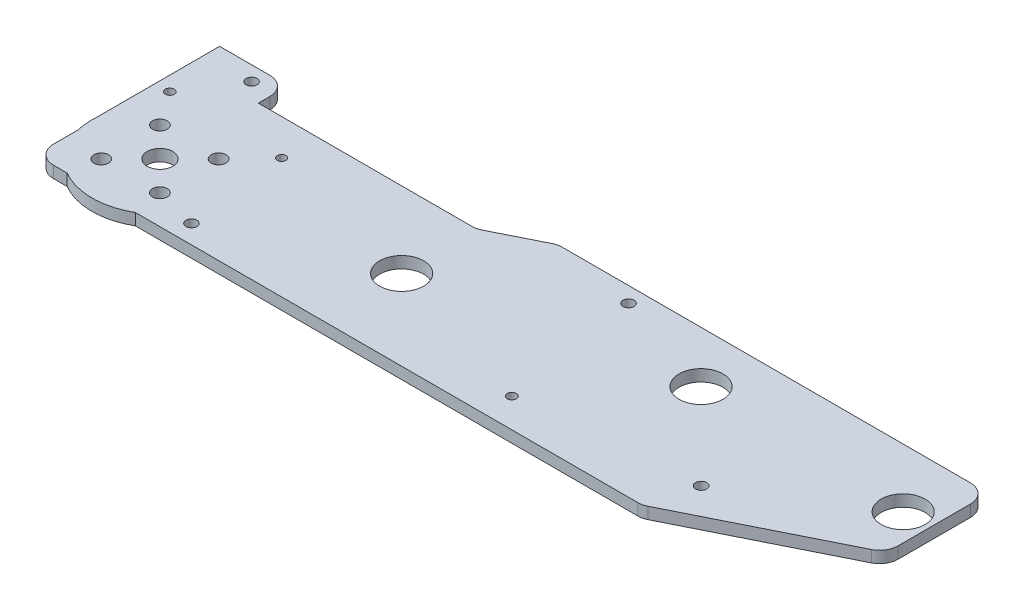
ISO-10303-21;
HEADER;
FILE_DESCRIPTION(('STEP AP214'),'2;1');
FILE_NAME('part.step','',(''),(''),'','','');
FILE_SCHEMA(('AUTOMOTIVE_DESIGN { 1 0 10303 214 1 1 1 1 }'));
ENDSEC;
DATA;
#1=APPLICATION_CONTEXT('core data for automotive mechanical design processes');
#2=APPLICATION_PROTOCOL_DEFINITION('international standard','automotive_design',2000,#1);
#3=PRODUCT_CONTEXT('',#1,'mechanical');
#4=PRODUCT('Part','Part','',(#3));
#5=PRODUCT_RELATED_PRODUCT_CATEGORY('part','',(#4));
#6=PRODUCT_DEFINITION_FORMATION('','',#4);
#7=PRODUCT_DEFINITION_CONTEXT('part definition',#1,'design');
#8=PRODUCT_DEFINITION('design','',#6,#7);
#9=PRODUCT_DEFINITION_SHAPE('','',#8);
#10=(LENGTH_UNIT() NAMED_UNIT(*) SI_UNIT(.MILLI.,.METRE.));
#11=(NAMED_UNIT(*) PLANE_ANGLE_UNIT() SI_UNIT($,.RADIAN.));
#12=(NAMED_UNIT(*) SI_UNIT($,.STERADIAN.) SOLID_ANGLE_UNIT());
#13=UNCERTAINTY_MEASURE_WITH_UNIT(LENGTH_MEASURE(1.E-05),#10,'distance_accuracy_value','');
#14=(GEOMETRIC_REPRESENTATION_CONTEXT(3) GLOBAL_UNCERTAINTY_ASSIGNED_CONTEXT((#13)) GLOBAL_UNIT_ASSIGNED_CONTEXT((#10,
#11,#12)) REPRESENTATION_CONTEXT('',''));
#15=CARTESIAN_POINT('',(0.,0.,0.));
#16=DIRECTION('',(0.,0.,1.));
#17=DIRECTION('',(1.,0.,0.));
#18=AXIS2_PLACEMENT_3D('',#15,#16,#17);
#19=CARTESIAN_POINT('',(18.,0.,34.));
#20=DIRECTION('',(0.,1.,0.));
#21=DIRECTION('',(0.,0.,1.));
#22=AXIS2_PLACEMENT_3D('',#19,#20,#21);
#23=CYLINDRICAL_SURFACE('',#22,18.5);
#24=CARTESIAN_POINT('',(18.,3.175,34.));
#25=DIRECTION('',(0.,1.,0.));
#26=DIRECTION('',(0.,0.,1.));
#27=AXIS2_PLACEMENT_3D('',#24,#25,#26);
#28=CIRCLE('',#27,18.5);
#29=CARTESIAN_POINT('',(-0.445022074948467,3.175,32.5748120633884));
#30=VERTEX_POINT('',#29);
#31=CARTESIAN_POINT('',(0.,3.175,38.2720018726587));
#32=VERTEX_POINT('',#31);
#33=EDGE_CURVE('E189',#30,#32,#28,.T.);
#34=ORIENTED_EDGE('',*,*,#33,.F.);
#35=DIRECTION('',(0.,1.,0.));
#36=VECTOR('',#35,1.);
#37=CARTESIAN_POINT('',(-0.445022074948467,0.,32.5748120633884));
#38=LINE('',#37,#36);
#39=CARTESIAN_POINT('',(-0.445022074948481,0.,32.5748120633884));
#40=VERTEX_POINT('',#39);
#41=EDGE_CURVE('E173',#30,#40,#38,.F.);
#42=ORIENTED_EDGE('',*,*,#41,.T.);
#43=CARTESIAN_POINT('',(18.,0.,34.));
#44=DIRECTION('',(0.,1.,0.));
#45=DIRECTION('',(0.,0.,1.));
#46=AXIS2_PLACEMENT_3D('',#43,#44,#45);
#47=CIRCLE('',#46,18.5);
#48=CARTESIAN_POINT('',(0.,0.,38.2720018726587));
#49=VERTEX_POINT('',#48);
#50=EDGE_CURVE('E199',#40,#49,#47,.T.);
#51=ORIENTED_EDGE('',*,*,#50,.T.);
#52=DIRECTION('',(0.,1.,0.));
#53=VECTOR('',#52,1.);
#54=CARTESIAN_POINT('',(0.,0.,38.2720018726587));
#55=LINE('',#54,#53);
#56=EDGE_CURVE('E194',#32,#49,#55,.F.);
#57=ORIENTED_EDGE('',*,*,#56,.F.);
#58=EDGE_LOOP('',(#34,#42,#51,#57));
#59=FACE_BOUND('',#58,.T.);
#60=ADVANCED_FACE('F34',(#59),#23,.T.);
#61=CARTESIAN_POINT('',(77.654770619872,-6.825,7.40281206338842));
#62=DIRECTION('',(0.,0.,1.));
#63=DIRECTION('',(1.,0.,0.));
#64=AXIS2_PLACEMENT_3D('',#61,#62,#63);
#65=PLANE('',#64);
#66=DIRECTION('',(0.,-1.,0.));
#67=VECTOR('',#66,1.);
#68=CARTESIAN_POINT('',(18.2576402812913,0.,7.40281206338842));
#69=LINE('',#68,#67);
#70=CARTESIAN_POINT('',(18.2576402812913,3.175,7.40281206338842));
#71=VERTEX_POINT('',#70);
#72=CARTESIAN_POINT('',(18.2576402812913,0.,7.40281206338842));
#73=VERTEX_POINT('',#72);
#74=EDGE_CURVE('E384',#71,#73,#69,.T.);
#75=ORIENTED_EDGE('',*,*,#74,.F.);
#76=DIRECTION('',(1.,0.,0.));
#77=VECTOR('',#76,1.);
#78=CARTESIAN_POINT('',(77.654770619872,3.175,7.40281206338842));
#79=LINE('',#78,#77);
#80=CARTESIAN_POINT('',(76.4795591487987,3.175,7.40281206338842));
#81=VERTEX_POINT('',#80);
#82=EDGE_CURVE('E205',#71,#81,#79,.T.);
#83=ORIENTED_EDGE('',*,*,#82,.T.);
#84=DIRECTION('',(0.,1.,0.));
#85=VECTOR('',#84,1.);
#86=CARTESIAN_POINT('',(76.4795591487987,0.,7.40281206338842));
#87=LINE('',#86,#85);
#88=CARTESIAN_POINT('',(76.4795591487987,0.,7.40281206338842));
#89=VERTEX_POINT('',#88);
#90=EDGE_CURVE('E321',#81,#89,#87,.F.);
#91=ORIENTED_EDGE('',*,*,#90,.T.);
#92=DIRECTION('',(1.,0.,0.));
#93=VECTOR('',#92,1.);
#94=CARTESIAN_POINT('',(0.,0.,7.40281206338842));
#95=LINE('',#94,#93);
#96=EDGE_CURVE('E219',#73,#89,#95,.T.);
#97=ORIENTED_EDGE('',*,*,#96,.F.);
#98=EDGE_LOOP('',(#75,#83,#91,#97));
#99=FACE_BOUND('',#98,.T.);
#100=ADVANCED_FACE('F415',(#99),#65,.F.);
#101=CARTESIAN_POINT('',(0.,3.175,50.));
#102=DIRECTION('',(0.,0.,-1.));
#103=DIRECTION('',(-1.,0.,0.));
#104=AXIS2_PLACEMENT_3D('',#101,#102,#103);
#105=PLANE('',#104);
#106=DIRECTION('',(1.,0.,0.));
#107=VECTOR('',#106,1.);
#108=CARTESIAN_POINT('',(0.,3.175,50.));
#109=LINE('',#108,#107);
#110=CARTESIAN_POINT('',(5.00000000000001,3.175,50.));
#111=VERTEX_POINT('',#110);
#112=CARTESIAN_POINT('',(8.71291218949668,3.175,50.));
#113=VERTEX_POINT('',#112);
#114=EDGE_CURVE('E281',#111,#113,#109,.T.);
#115=ORIENTED_EDGE('',*,*,#114,.F.);
#116=DIRECTION('',(0.,-1.,0.));
#117=VECTOR('',#116,1.);
#118=CARTESIAN_POINT('',(5.00000000000001,3.175,50.));
#119=LINE('',#118,#117);
#120=CARTESIAN_POINT('',(5.00000000000001,0.,50.));
#121=VERTEX_POINT('',#120);
#122=EDGE_CURVE('E182',#111,#121,#119,.T.);
#123=ORIENTED_EDGE('',*,*,#122,.T.);
#124=DIRECTION('',(1.,0.,0.));
#125=VECTOR('',#124,1.);
#126=CARTESIAN_POINT('',(0.,0.,50.));
#127=LINE('',#126,#125);
#128=CARTESIAN_POINT('',(8.71291218949668,0.,50.));
#129=VERTEX_POINT('',#128);
#130=EDGE_CURVE('E293',#121,#129,#127,.T.);
#131=ORIENTED_EDGE('',*,*,#130,.T.);
#132=DIRECTION('',(0.,1.,0.));
#133=VECTOR('',#132,1.);
#134=CARTESIAN_POINT('',(8.71291218949668,0.,50.));
#135=LINE('',#134,#133);
#136=EDGE_CURVE('E183',#129,#113,#135,.T.);
#137=ORIENTED_EDGE('',*,*,#136,.T.);
#138=EDGE_LOOP('',(#115,#123,#131,#137));
#139=FACE_BOUND('',#138,.T.);
#140=ADVANCED_FACE('F474',(#139),#105,.F.);
#141=CARTESIAN_POINT('',(0.,3.175,0.));
#142=DIRECTION('',(0.,1.,0.));
#143=DIRECTION('',(0.,0.,1.));
#144=AXIS2_PLACEMENT_3D('',#141,#142,#143);
#145=PLANE('',#144);
#146=DIRECTION('',(0.,0.,-1.));
#147=VECTOR('',#146,1.);
#148=CARTESIAN_POINT('',(-0.445022074948467,3.175,32.5748120633884));
#149=LINE('',#148,#147);
#150=CARTESIAN_POINT('',(-0.445022074948467,3.175,-0.725187936611575));
#151=VERTEX_POINT('',#150);
#152=EDGE_CURVE('E176',#30,#151,#149,.T.);
#153=ORIENTED_EDGE('',*,*,#152,.F.);
#154=ORIENTED_EDGE('',*,*,#33,.T.);
#155=DIRECTION('',(0.,0.,1.));
#156=VECTOR('',#155,1.);
#157=CARTESIAN_POINT('',(0.,3.175,0.));
#158=LINE('',#157,#156);
#159=CARTESIAN_POINT('',(0.,3.175,45.));
#160=VERTEX_POINT('',#159);
#161=EDGE_CURVE('E277',#32,#160,#158,.T.);
#162=ORIENTED_EDGE('',*,*,#161,.T.);
#163=CARTESIAN_POINT('',(5.00000000000001,3.175,45.));
#164=DIRECTION('',(0.,1.,0.));
#165=DIRECTION('',(0.,0.,1.));
#166=AXIS2_PLACEMENT_3D('',#163,#164,#165);
#167=CIRCLE('',#166,5.);
#168=EDGE_CURVE('E379',#160,#111,#167,.T.);
#169=ORIENTED_EDGE('',*,*,#168,.T.);
#170=ORIENTED_EDGE('',*,*,#114,.T.);
#171=CARTESIAN_POINT('',(27.2870878105033,3.175,50.));
#172=VERTEX_POINT('',#171);
#173=EDGE_CURVE('E197',#113,#172,#28,.T.);
#174=ORIENTED_EDGE('',*,*,#173,.T.);
#175=CARTESIAN_POINT('',(164.327666523127,3.175,50.));
#176=VERTEX_POINT('',#175);
#177=EDGE_CURVE('E279',#172,#176,#109,.T.);
#178=ORIENTED_EDGE('',*,*,#177,.T.);
#179=CARTESIAN_POINT('',(164.327666523127,3.175,45.));
#180=DIRECTION('',(0.,1.,0.));
#181=DIRECTION('',(0.,0.,1.));
#182=AXIS2_PLACEMENT_3D('',#179,#180,#181);
#183=CIRCLE('',#182,5.);
#184=CARTESIAN_POINT('',(166.555038564004,3.175,49.4764733654425));
#185=VERTEX_POINT('',#184);
#186=EDGE_CURVE('E330',#176,#185,#183,.T.);
#187=ORIENTED_EDGE('',*,*,#186,.T.);
#188=DIRECTION('',(-0.895294673088504,0.,0.445474408175541));
#189=VECTOR('',#188,1.);
#190=CARTESIAN_POINT('',(210.,3.175,27.8594359076578));
#191=LINE('',#190,#189);
#192=CARTESIAN_POINT('',(207.227372040878,3.175,29.2390205699011));
#193=VERTEX_POINT('',#192);
#194=EDGE_CURVE('E206',#193,#185,#191,.T.);
#195=ORIENTED_EDGE('',*,*,#194,.F.);
#196=CARTESIAN_POINT('',(205.,3.175,24.7625472044585));
#197=DIRECTION('',(0.,1.,0.));
#198=DIRECTION('',(0.,0.,1.));
#199=AXIS2_PLACEMENT_3D('',#196,#197,#198);
#200=CIRCLE('',#199,5.);
#201=CARTESIAN_POINT('',(210.,3.175,24.7625472044585));
#202=VERTEX_POINT('',#201);
#203=EDGE_CURVE('E332',#193,#202,#200,.T.);
#204=ORIENTED_EDGE('',*,*,#203,.T.);
#205=DIRECTION('',(0.,0.,-1.));
#206=VECTOR('',#205,1.);
#207=CARTESIAN_POINT('',(210.,3.175,0.));
#208=LINE('',#207,#206);
#209=CARTESIAN_POINT('',(210.,3.175,5.));
#210=VERTEX_POINT('',#209);
#211=EDGE_CURVE('E283',#202,#210,#208,.T.);
#212=ORIENTED_EDGE('',*,*,#211,.T.);
#213=CARTESIAN_POINT('',(205.,3.175,5.));
#214=DIRECTION('',(0.,1.,0.));
#215=DIRECTION('',(0.,0.,1.));
#216=AXIS2_PLACEMENT_3D('',#213,#214,#215);
#217=CIRCLE('',#216,5.);
#218=CARTESIAN_POINT('',(205.,3.175,0.));
#219=VERTEX_POINT('',#218);
#220=EDGE_CURVE('E334',#210,#219,#217,.T.);
#221=ORIENTED_EDGE('',*,*,#220,.T.);
#222=DIRECTION('',(-1.,0.,0.));
#223=VECTOR('',#222,1.);
#224=CARTESIAN_POINT('',(0.,3.175,0.));
#225=LINE('',#224,#223);
#226=CARTESIAN_POINT('',(93.707824868426,3.175,0.));
#227=VERTEX_POINT('',#226);
#228=EDGE_CURVE('E286',#219,#227,#225,.T.);
#229=ORIENTED_EDGE('',*,*,#228,.T.);
#230=CARTESIAN_POINT('',(93.707824868426,3.175,5.));
#231=DIRECTION('',(0.,1.,0.));
#232=DIRECTION('',(0.,0.,1.));
#233=AXIS2_PLACEMENT_3D('',#230,#231,#232);
#234=CIRCLE('',#233,5.);
#235=CARTESIAN_POINT('',(91.4804528275483,3.175,0.523526634557481));
#236=VERTEX_POINT('',#235);
#237=EDGE_CURVE('E336',#227,#236,#234,.T.);
#238=ORIENTED_EDGE('',*,*,#237,.T.);
#239=DIRECTION('',(0.895294673088504,0.,-0.445474408175541));
#240=VECTOR('',#239,1.);
#241=CARTESIAN_POINT('',(92.5326133973527,3.175,0.));
#242=LINE('',#241,#240);
#243=CARTESIAN_POINT('',(78.7069311896764,3.175,6.87928542883094));
#244=VERTEX_POINT('',#243);
#245=EDGE_CURVE('E210',#244,#236,#242,.T.);
#246=ORIENTED_EDGE('',*,*,#245,.F.);
#247=CARTESIAN_POINT('',(76.4795591487987,3.175,2.40281206338842));
#248=DIRECTION('',(0.,1.,0.));
#249=DIRECTION('',(0.,0.,1.));
#250=AXIS2_PLACEMENT_3D('',#247,#248,#249);
#251=CIRCLE('',#250,5.);
#252=EDGE_CURVE('E359',#244,#81,#251,.F.);
#253=ORIENTED_EDGE('',*,*,#252,.T.);
#254=ORIENTED_EDGE('',*,*,#82,.F.);
#255=DIRECTION('',(0.,0.,1.));
#256=VECTOR('',#255,1.);
#257=CARTESIAN_POINT('',(18.2576402812913,3.175,-0.725187936611574));
#258=LINE('',#257,#256);
#259=CARTESIAN_POINT('',(18.2576402812913,3.175,4.27481206338843));
#260=VERTEX_POINT('',#259);
#261=EDGE_CURVE('E201',#260,#71,#258,.T.);
#262=ORIENTED_EDGE('',*,*,#261,.F.);
#263=CARTESIAN_POINT('',(13.2576402812913,3.175,4.27481206338843));
#264=DIRECTION('',(0.,1.,0.));
#265=DIRECTION('',(0.,0.,1.));
#266=AXIS2_PLACEMENT_3D('',#263,#264,#265);
#267=CIRCLE('',#266,5.);
#268=CARTESIAN_POINT('',(13.2576402812913,3.175,-0.725187936611574));
#269=VERTEX_POINT('',#268);
#270=EDGE_CURVE('E377',#260,#269,#267,.T.);
#271=ORIENTED_EDGE('',*,*,#270,.T.);
#272=DIRECTION('',(1.,0.,0.));
#273=VECTOR('',#272,1.);
#274=CARTESIAN_POINT('',(0.,3.175,-0.725187936611574));
#275=LINE('',#274,#273);
#276=EDGE_CURVE('E51',#151,#269,#275,.T.);
#277=ORIENTED_EDGE('',*,*,#276,.F.);
#278=EDGE_LOOP('',(#153,#154,#162,#169,#170,#174,#178,#187,#195,#204,#212,#221,#229,#238,#246,
#253,#254,#262,#271,#277));
#279=FACE_BOUND('',#278,.T.);
#280=CARTESIAN_POINT('',(12.2576402812913,3.175,3.27481206338843));
#281=DIRECTION('',(0.,1.,0.));
#282=DIRECTION('',(0.,0.,1.));
#283=AXIS2_PLACEMENT_3D('',#280,#281,#282);
#284=CIRCLE('',#283,1.5);
#285=CARTESIAN_POINT('',(12.2576402812913,3.175,4.77481206338842));
#286=VERTEX_POINT('',#285);
#287=EDGE_CURVE('E398',#286,#286,#284,.T.);
#288=ORIENTED_EDGE('',*,*,#287,.F.);
#289=EDGE_LOOP('',(#288));
#290=FACE_BOUND('',#289,.T.);
#291=CARTESIAN_POINT('',(116.,3.175,4.23721477368133));
#292=DIRECTION('',(0.,1.,0.));
#293=DIRECTION('',(0.,0.,1.));
#294=AXIS2_PLACEMENT_3D('',#291,#292,#293);
#295=CIRCLE('',#294,1.5);
#296=CARTESIAN_POINT('',(116.,3.175,5.73721477368133));
#297=VERTEX_POINT('',#296);
#298=EDGE_CURVE('E388',#297,#297,#295,.T.);
#299=ORIENTED_EDGE('',*,*,#298,.F.);
#300=EDGE_LOOP('',(#299));
#301=FACE_BOUND('',#300,.T.);
#302=CARTESIAN_POINT('',(18.,3.175,34.));
#303=DIRECTION('',(0.,1.,0.));
#304=DIRECTION('',(0.,0.,1.));
#305=AXIS2_PLACEMENT_3D('',#302,#303,#304);
#306=CIRCLE('',#305,3.5);
#307=CARTESIAN_POINT('',(18.,3.175,37.5));
#308=VERTEX_POINT('',#307);
#309=EDGE_CURVE('E385',#308,#308,#306,.T.);
#310=ORIENTED_EDGE('',*,*,#309,.F.);
#311=EDGE_LOOP('',(#310));
#312=FACE_BOUND('',#311,.T.);
#313=CARTESIAN_POINT('',(10.,3.175,26.));
#314=DIRECTION('',(0.,1.,0.));
#315=DIRECTION('',(0.,0.,1.));
#316=AXIS2_PLACEMENT_3D('',#313,#314,#315);
#317=CIRCLE('',#316,2.);
#318=CARTESIAN_POINT('',(10.,3.175,28.));
#319=VERTEX_POINT('',#318);
#320=EDGE_CURVE('E239',#319,#319,#317,.T.);
#321=ORIENTED_EDGE('',*,*,#320,.F.);
#322=EDGE_LOOP('',(#321));
#323=FACE_BOUND('',#322,.T.);
#324=CARTESIAN_POINT('',(26.,3.175,42.));
#325=DIRECTION('',(0.,1.,0.));
#326=DIRECTION('',(0.,0.,1.));
#327=AXIS2_PLACEMENT_3D('',#324,#325,#326);
#328=CIRCLE('',#327,2.);
#329=CARTESIAN_POINT('',(26.,3.175,44.));
#330=VERTEX_POINT('',#329);
#331=EDGE_CURVE('E231',#330,#330,#328,.T.);
#332=ORIENTED_EDGE('',*,*,#331,.F.);
#333=EDGE_LOOP('',(#332));
#334=FACE_BOUND('',#333,.T.);
#335=CARTESIAN_POINT('',(26.,3.175,26.));
#336=DIRECTION('',(0.,1.,0.));
#337=DIRECTION('',(0.,0.,1.));
#338=AXIS2_PLACEMENT_3D('',#335,#336,#337);
#339=CIRCLE('',#338,2.00000000000001);
#340=CARTESIAN_POINT('',(26.,3.175,28.));
#341=VERTEX_POINT('',#340);
#342=EDGE_CURVE('E234',#341,#341,#339,.T.);
#343=ORIENTED_EDGE('',*,*,#342,.F.);
#344=EDGE_LOOP('',(#343));
#345=FACE_BOUND('',#344,.T.);
#346=CARTESIAN_POINT('',(10.,3.175,42.));
#347=DIRECTION('',(0.,1.,0.));
#348=DIRECTION('',(0.,0.,1.));
#349=AXIS2_PLACEMENT_3D('',#346,#347,#348);
#350=CIRCLE('',#349,2.);
#351=CARTESIAN_POINT('',(10.,3.175,44.));
#352=VERTEX_POINT('',#351);
#353=EDGE_CURVE('E236',#352,#352,#350,.T.);
#354=ORIENTED_EDGE('',*,*,#353,.F.);
#355=EDGE_LOOP('',(#354));
#356=FACE_BOUND('',#355,.T.);
#357=CARTESIAN_POINT('',(145.531297368261,3.175,14.));
#358=DIRECTION('',(0.,1.,0.));
#359=DIRECTION('',(0.,0.,1.));
#360=AXIS2_PLACEMENT_3D('',#357,#358,#359);
#361=CIRCLE('',#360,6.00000000000002);
#362=CARTESIAN_POINT('',(145.531297368261,3.175,20.));
#363=VERTEX_POINT('',#362);
#364=EDGE_CURVE('E221',#363,#363,#361,.T.);
#365=ORIENTED_EDGE('',*,*,#364,.F.);
#366=EDGE_LOOP('',(#365));
#367=FACE_BOUND('',#366,.T.);
#368=CARTESIAN_POINT('',(202.646291021416,3.175,16.));
#369=DIRECTION('',(0.,1.,0.));
#370=DIRECTION('',(0.,0.,1.));
#371=AXIS2_PLACEMENT_3D('',#368,#369,#370);
#372=CIRCLE('',#371,6.00000000000002);
#373=CARTESIAN_POINT('',(202.646291021416,3.175,22.));
#374=VERTEX_POINT('',#373);
#375=EDGE_CURVE('E222',#374,#374,#372,.T.);
#376=ORIENTED_EDGE('',*,*,#375,.F.);
#377=EDGE_LOOP('',(#376));
#378=FACE_BOUND('',#377,.T.);
#379=CARTESIAN_POINT('',(78.0102637901218,3.175,28.1));
#380=DIRECTION('',(0.,1.,0.));
#381=DIRECTION('',(0.,0.,1.));
#382=AXIS2_PLACEMENT_3D('',#379,#380,#381);
#383=CIRCLE('',#382,6.);
#384=CARTESIAN_POINT('',(78.0102637901218,3.175,34.1));
#385=VERTEX_POINT('',#384);
#386=EDGE_CURVE('E225',#385,#385,#383,.T.);
#387=ORIENTED_EDGE('',*,*,#386,.F.);
#388=EDGE_LOOP('',(#387));
#389=FACE_BOUND('',#388,.T.);
#390=CARTESIAN_POINT('',(168.975233936324,3.175,37.4032096333009));
#391=DIRECTION('',(0.,1.,0.));
#392=DIRECTION('',(0.,0.,1.));
#393=AXIS2_PLACEMENT_3D('',#390,#391,#392);
#394=CIRCLE('',#393,1.51727390455077);
#395=CARTESIAN_POINT('',(168.975233936324,3.175,38.9204835378516));
#396=VERTEX_POINT('',#395);
#397=EDGE_CURVE('E245',#396,#396,#394,.T.);
#398=ORIENTED_EDGE('',*,*,#397,.F.);
#399=EDGE_LOOP('',(#398));
#400=FACE_BOUND('',#399,.T.);
#401=CARTESIAN_POINT('',(37.5207499584055,3.175,44.9211981208464));
#402=DIRECTION('',(0.,1.,0.));
#403=DIRECTION('',(0.,0.,1.));
#404=AXIS2_PLACEMENT_3D('',#401,#402,#403);
#405=CIRCLE('',#404,1.5);
#406=CARTESIAN_POINT('',(37.5207499584055,3.175,46.4211981208464));
#407=VERTEX_POINT('',#406);
#408=EDGE_CURVE('E259',#407,#407,#405,.T.);
#409=ORIENTED_EDGE('',*,*,#408,.F.);
#410=EDGE_LOOP('',(#409));
#411=FACE_BOUND('',#410,.T.);
#412=CARTESIAN_POINT('',(3.48952623314989,3.175,16.7876611115987));
#413=DIRECTION('',(0.,1.,0.));
#414=DIRECTION('',(0.,0.,1.));
#415=AXIS2_PLACEMENT_3D('',#412,#413,#414);
#416=CIRCLE('',#415,1.21166501790718);
#417=CARTESIAN_POINT('',(3.48952623314989,3.175,17.9993261295059));
#418=VERTEX_POINT('',#417);
#419=EDGE_CURVE('E271',#418,#418,#416,.T.);
#420=ORIENTED_EDGE('',*,*,#419,.F.);
#421=EDGE_LOOP('',(#420));
#422=FACE_BOUND('',#421,.T.);
#423=CARTESIAN_POINT('',(34.3725877204713,3.175,17.1940052448511));
#424=DIRECTION('',(0.,1.,0.));
#425=DIRECTION('',(0.,0.,1.));
#426=AXIS2_PLACEMENT_3D('',#423,#424,#425);
#427=CIRCLE('',#426,1.16561711842174);
#428=CARTESIAN_POINT('',(34.3725877204713,3.175,18.3596223632728));
#429=VERTEX_POINT('',#428);
#430=EDGE_CURVE('E265',#429,#429,#427,.T.);
#431=ORIENTED_EDGE('',*,*,#430,.F.);
#432=EDGE_LOOP('',(#431));
#433=FACE_BOUND('',#432,.T.);
#434=CARTESIAN_POINT('',(122.,3.175,42.0581398050981));
#435=DIRECTION('',(0.,1.,0.));
#436=DIRECTION('',(0.,0.,1.));
#437=AXIS2_PLACEMENT_3D('',#434,#435,#436);
#438=CIRCLE('',#437,1.25);
#439=CARTESIAN_POINT('',(122.,3.175,43.3081398050981));
#440=VERTEX_POINT('',#439);
#441=EDGE_CURVE('E253',#440,#440,#438,.T.);
#442=ORIENTED_EDGE('',*,*,#441,.F.);
#443=EDGE_LOOP('',(#442));
#444=FACE_BOUND('',#443,.T.);
#445=ADVANCED_FACE('F186',(#279,#290,#301,#312,#323,#334,#345,#356,#367,#378,#389,#400,#411,
#422,#433,#444),#145,.T.);
#446=CARTESIAN_POINT('',(0.,0.,0.));
#447=DIRECTION('',(0.,1.,0.));
#448=DIRECTION('',(0.,0.,1.));
#449=AXIS2_PLACEMENT_3D('',#446,#447,#448);
#450=PLANE('',#449);
#451=CARTESIAN_POINT('',(12.2576402812913,0.,3.27481206338843));
#452=DIRECTION('',(0.,1.,0.));
#453=DIRECTION('',(0.,0.,1.));
#454=AXIS2_PLACEMENT_3D('',#451,#452,#453);
#455=CIRCLE('',#454,1.5);
#456=CARTESIAN_POINT('',(12.2576402812913,0.,4.77481206338842));
#457=VERTEX_POINT('',#456);
#458=EDGE_CURVE('E38',#457,#457,#455,.T.);
#459=ORIENTED_EDGE('',*,*,#458,.T.);
#460=EDGE_LOOP('',(#459));
#461=FACE_BOUND('',#460,.T.);
#462=CARTESIAN_POINT('',(116.,0.,4.23721477368133));
#463=DIRECTION('',(0.,1.,0.));
#464=DIRECTION('',(0.,0.,1.));
#465=AXIS2_PLACEMENT_3D('',#462,#463,#464);
#466=CIRCLE('',#465,1.5);
#467=CARTESIAN_POINT('',(116.,0.,5.73721477368133));
#468=VERTEX_POINT('',#467);
#469=EDGE_CURVE('E386',#468,#468,#466,.T.);
#470=ORIENTED_EDGE('',*,*,#469,.T.);
#471=EDGE_LOOP('',(#470));
#472=FACE_BOUND('',#471,.T.);
#473=CARTESIAN_POINT('',(18.,0.,34.));
#474=DIRECTION('',(0.,1.,0.));
#475=DIRECTION('',(0.,0.,1.));
#476=AXIS2_PLACEMENT_3D('',#473,#474,#475);
#477=CIRCLE('',#476,3.5);
#478=CARTESIAN_POINT('',(18.,0.,37.5));
#479=VERTEX_POINT('',#478);
#480=EDGE_CURVE('E382',#479,#479,#477,.T.);
#481=ORIENTED_EDGE('',*,*,#480,.T.);
#482=EDGE_LOOP('',(#481));
#483=FACE_BOUND('',#482,.T.);
#484=ORIENTED_EDGE('',*,*,#50,.F.);
#485=DIRECTION('',(0.,0.,-1.));
#486=VECTOR('',#485,1.);
#487=CARTESIAN_POINT('',(-0.445022074948467,0.,0.));
#488=LINE('',#487,#486);
#489=CARTESIAN_POINT('',(-0.445022074948467,0.,-0.725187936611574));
#490=VERTEX_POINT('',#489);
#491=EDGE_CURVE('E178',#40,#490,#488,.T.);
#492=ORIENTED_EDGE('',*,*,#491,.T.);
#493=DIRECTION('',(-1.,0.,0.));
#494=VECTOR('',#493,1.);
#495=CARTESIAN_POINT('',(0.,0.,-0.725187936611574));
#496=LINE('',#495,#494);
#497=CARTESIAN_POINT('',(13.2576402812913,0.,-0.725187936611574));
#498=VERTEX_POINT('',#497);
#499=EDGE_CURVE('E403',#498,#490,#496,.T.);
#500=ORIENTED_EDGE('',*,*,#499,.F.);
#501=CARTESIAN_POINT('',(13.2576402812913,0.,4.27481206338843));
#502=DIRECTION('',(0.,1.,0.));
#503=DIRECTION('',(0.,0.,1.));
#504=AXIS2_PLACEMENT_3D('',#501,#502,#503);
#505=CIRCLE('',#504,5.);
#506=CARTESIAN_POINT('',(18.2576402812913,0.,4.27481206338843));
#507=VERTEX_POINT('',#506);
#508=EDGE_CURVE('E371',#498,#507,#505,.F.);
#509=ORIENTED_EDGE('',*,*,#508,.T.);
#510=DIRECTION('',(0.,0.,1.));
#511=VECTOR('',#510,1.);
#512=CARTESIAN_POINT('',(18.2576402812913,0.,-0.725187936611574));
#513=LINE('',#512,#511);
#514=EDGE_CURVE('E406',#507,#73,#513,.T.);
#515=ORIENTED_EDGE('',*,*,#514,.T.);
#516=ORIENTED_EDGE('',*,*,#96,.T.);
#517=CARTESIAN_POINT('',(76.4795591487987,0.,2.40281206338842));
#518=DIRECTION('',(0.,1.,0.));
#519=DIRECTION('',(0.,0.,1.));
#520=AXIS2_PLACEMENT_3D('',#517,#518,#519);
#521=CIRCLE('',#520,5.);
#522=CARTESIAN_POINT('',(78.7069311896765,0.,6.87928542883095));
#523=VERTEX_POINT('',#522);
#524=EDGE_CURVE('E362',#89,#523,#521,.T.);
#525=ORIENTED_EDGE('',*,*,#524,.T.);
#526=DIRECTION('',(0.895294673088504,0.,-0.445474408175541));
#527=VECTOR('',#526,1.);
#528=CARTESIAN_POINT('',(18.362861016876,0.,36.9048622083704));
#529=LINE('',#528,#527);
#530=CARTESIAN_POINT('',(91.4804528275483,0.,0.523526634557479));
#531=VERTEX_POINT('',#530);
#532=EDGE_CURVE('E209',#523,#531,#529,.T.);
#533=ORIENTED_EDGE('',*,*,#532,.T.);
#534=CARTESIAN_POINT('',(93.707824868426,0.,5.));
#535=DIRECTION('',(0.,1.,0.));
#536=DIRECTION('',(0.,0.,1.));
#537=AXIS2_PLACEMENT_3D('',#534,#535,#536);
#538=CIRCLE('',#537,5.);
#539=CARTESIAN_POINT('',(93.707824868426,0.,0.));
#540=VERTEX_POINT('',#539);
#541=EDGE_CURVE('E345',#531,#540,#538,.F.);
#542=ORIENTED_EDGE('',*,*,#541,.T.);
#543=DIRECTION('',(-1.,0.,0.));
#544=VECTOR('',#543,1.);
#545=CARTESIAN_POINT('',(0.,0.,0.));
#546=LINE('',#545,#544);
#547=CARTESIAN_POINT('',(205.,0.,0.));
#548=VERTEX_POINT('',#547);
#549=EDGE_CURVE('E280',#548,#540,#546,.T.);
#550=ORIENTED_EDGE('',*,*,#549,.F.);
#551=CARTESIAN_POINT('',(205.,0.,5.));
#552=DIRECTION('',(0.,1.,0.));
#553=DIRECTION('',(0.,0.,1.));
#554=AXIS2_PLACEMENT_3D('',#551,#552,#553);
#555=CIRCLE('',#554,5.);
#556=CARTESIAN_POINT('',(210.,0.,5.));
#557=VERTEX_POINT('',#556);
#558=EDGE_CURVE('E343',#548,#557,#555,.F.);
#559=ORIENTED_EDGE('',*,*,#558,.T.);
#560=DIRECTION('',(0.,0.,-1.));
#561=VECTOR('',#560,1.);
#562=CARTESIAN_POINT('',(210.,0.,0.));
#563=LINE('',#562,#561);
#564=CARTESIAN_POINT('',(210.,0.,24.7625472044585));
#565=VERTEX_POINT('',#564);
#566=EDGE_CURVE('E295',#565,#557,#563,.T.);
#567=ORIENTED_EDGE('',*,*,#566,.F.);
#568=CARTESIAN_POINT('',(205.,0.,24.7625472044585));
#569=DIRECTION('',(0.,1.,0.));
#570=DIRECTION('',(0.,0.,1.));
#571=AXIS2_PLACEMENT_3D('',#568,#569,#570);
#572=CIRCLE('',#571,5.);
#573=CARTESIAN_POINT('',(207.227372040878,0.,29.2390205699011));
#574=VERTEX_POINT('',#573);
#575=EDGE_CURVE('E341',#565,#574,#572,.F.);
#576=ORIENTED_EDGE('',*,*,#575,.T.);
#577=DIRECTION('',(-0.895294673088504,0.,0.445474408175541));
#578=VECTOR('',#577,1.);
#579=CARTESIAN_POINT('',(52.7851670626083,0.,106.085283513341));
#580=LINE('',#579,#578);
#581=CARTESIAN_POINT('',(166.555038564004,0.,49.4764733654425));
#582=VERTEX_POINT('',#581);
#583=EDGE_CURVE('E216',#574,#582,#580,.T.);
#584=ORIENTED_EDGE('',*,*,#583,.T.);
#585=CARTESIAN_POINT('',(164.327666523127,0.,45.));
#586=DIRECTION('',(0.,1.,0.));
#587=DIRECTION('',(0.,0.,1.));
#588=AXIS2_PLACEMENT_3D('',#585,#586,#587);
#589=CIRCLE('',#588,5.);
#590=CARTESIAN_POINT('',(164.327666523127,0.,50.));
#591=VERTEX_POINT('',#590);
#592=EDGE_CURVE('E338',#582,#591,#589,.F.);
#593=ORIENTED_EDGE('',*,*,#592,.T.);
#594=CARTESIAN_POINT('',(27.2870878105033,0.,50.));
#595=VERTEX_POINT('',#594);
#596=EDGE_CURVE('E292',#595,#591,#127,.T.);
#597=ORIENTED_EDGE('',*,*,#596,.F.);
#598=EDGE_CURVE('E196',#129,#595,#47,.T.);
#599=ORIENTED_EDGE('',*,*,#598,.F.);
#600=ORIENTED_EDGE('',*,*,#130,.F.);
#601=CARTESIAN_POINT('',(5.00000000000001,0.,45.));
#602=DIRECTION('',(0.,1.,0.));
#603=DIRECTION('',(0.,0.,1.));
#604=AXIS2_PLACEMENT_3D('',#601,#602,#603);
#605=CIRCLE('',#604,5.);
#606=CARTESIAN_POINT('',(0.,0.,45.));
#607=VERTEX_POINT('',#606);
#608=EDGE_CURVE('E373',#121,#607,#605,.F.);
#609=ORIENTED_EDGE('',*,*,#608,.T.);
#610=DIRECTION('',(0.,0.,1.));
#611=VECTOR('',#610,1.);
#612=CARTESIAN_POINT('',(0.,0.,0.));
#613=LINE('',#612,#611);
#614=EDGE_CURVE('E274',#49,#607,#613,.T.);
#615=ORIENTED_EDGE('',*,*,#614,.F.);
#616=EDGE_LOOP('',(#484,#492,#500,#509,#515,#516,#525,#533,#542,#550,#559,#567,#576,#584,#593,
#597,#599,#600,#609,#615));
#617=FACE_BOUND('',#616,.T.);
#618=CARTESIAN_POINT('',(145.531297368261,0.,14.));
#619=DIRECTION('',(0.,1.,0.));
#620=DIRECTION('',(0.,0.,1.));
#621=AXIS2_PLACEMENT_3D('',#618,#619,#620);
#622=CIRCLE('',#621,6.00000000000002);
#623=CARTESIAN_POINT('',(145.531297368261,0.,20.));
#624=VERTEX_POINT('',#623);
#625=EDGE_CURVE('E235',#624,#624,#622,.T.);
#626=ORIENTED_EDGE('',*,*,#625,.T.);
#627=EDGE_LOOP('',(#626));
#628=FACE_BOUND('',#627,.T.);
#629=CARTESIAN_POINT('',(202.646291021416,0.,16.));
#630=DIRECTION('',(0.,1.,0.));
#631=DIRECTION('',(0.,0.,1.));
#632=AXIS2_PLACEMENT_3D('',#629,#630,#631);
#633=CIRCLE('',#632,6.00000000000002);
#634=CARTESIAN_POINT('',(202.646291021416,0.,22.));
#635=VERTEX_POINT('',#634);
#636=EDGE_CURVE('E312',#635,#635,#633,.T.);
#637=ORIENTED_EDGE('',*,*,#636,.T.);
#638=EDGE_LOOP('',(#637));
#639=FACE_BOUND('',#638,.T.);
#640=CARTESIAN_POINT('',(78.0102637901218,0.,28.1));
#641=DIRECTION('',(0.,1.,0.));
#642=DIRECTION('',(0.,0.,1.));
#643=AXIS2_PLACEMENT_3D('',#640,#641,#642);
#644=CIRCLE('',#643,6.);
#645=CARTESIAN_POINT('',(78.0102637901218,0.,34.1));
#646=VERTEX_POINT('',#645);
#647=EDGE_CURVE('E230',#646,#646,#644,.T.);
#648=ORIENTED_EDGE('',*,*,#647,.T.);
#649=EDGE_LOOP('',(#648));
#650=FACE_BOUND('',#649,.T.);
#651=CARTESIAN_POINT('',(3.48952623314989,0.,16.7876611115987));
#652=DIRECTION('',(0.,1.,0.));
#653=DIRECTION('',(0.,0.,1.));
#654=AXIS2_PLACEMENT_3D('',#651,#652,#653);
#655=CIRCLE('',#654,1.21166501790718);
#656=CARTESIAN_POINT('',(3.48952623314989,0.,17.9993261295059));
#657=VERTEX_POINT('',#656);
#658=EDGE_CURVE('E268',#657,#657,#655,.T.);
#659=ORIENTED_EDGE('',*,*,#658,.T.);
#660=EDGE_LOOP('',(#659));
#661=FACE_BOUND('',#660,.T.);
#662=CARTESIAN_POINT('',(34.3725877204713,0.,17.1940052448511));
#663=DIRECTION('',(0.,1.,0.));
#664=DIRECTION('',(0.,0.,1.));
#665=AXIS2_PLACEMENT_3D('',#662,#663,#664);
#666=CIRCLE('',#665,1.16561711842174);
#667=CARTESIAN_POINT('',(34.3725877204713,0.,18.3596223632728));
#668=VERTEX_POINT('',#667);
#669=EDGE_CURVE('E262',#668,#668,#666,.T.);
#670=ORIENTED_EDGE('',*,*,#669,.T.);
#671=EDGE_LOOP('',(#670));
#672=FACE_BOUND('',#671,.T.);
#673=CARTESIAN_POINT('',(37.5207499584055,0.,44.9211981208464));
#674=DIRECTION('',(0.,1.,0.));
#675=DIRECTION('',(0.,0.,1.));
#676=AXIS2_PLACEMENT_3D('',#673,#674,#675);
#677=CIRCLE('',#676,1.5);
#678=CARTESIAN_POINT('',(37.5207499584055,0.,46.4211981208464));
#679=VERTEX_POINT('',#678);
#680=EDGE_CURVE('E256',#679,#679,#677,.T.);
#681=ORIENTED_EDGE('',*,*,#680,.T.);
#682=EDGE_LOOP('',(#681));
#683=FACE_BOUND('',#682,.T.);
#684=CARTESIAN_POINT('',(122.,0.,42.0581398050981));
#685=DIRECTION('',(0.,1.,0.));
#686=DIRECTION('',(0.,0.,1.));
#687=AXIS2_PLACEMENT_3D('',#684,#685,#686);
#688=CIRCLE('',#687,1.25);
#689=CARTESIAN_POINT('',(122.,0.,43.3081398050981));
#690=VERTEX_POINT('',#689);
#691=EDGE_CURVE('E248',#690,#690,#688,.T.);
#692=ORIENTED_EDGE('',*,*,#691,.T.);
#693=EDGE_LOOP('',(#692));
#694=FACE_BOUND('',#693,.T.);
#695=CARTESIAN_POINT('',(168.975233936324,0.,37.4032096333009));
#696=DIRECTION('',(0.,1.,0.));
#697=DIRECTION('',(0.,0.,1.));
#698=AXIS2_PLACEMENT_3D('',#695,#696,#697);
#699=CIRCLE('',#698,1.51727390455077);
#700=CARTESIAN_POINT('',(168.975233936324,0.,38.9204835378516));
#701=VERTEX_POINT('',#700);
#702=EDGE_CURVE('E249',#701,#701,#699,.T.);
#703=ORIENTED_EDGE('',*,*,#702,.T.);
#704=EDGE_LOOP('',(#703));
#705=FACE_BOUND('',#704,.T.);
#706=CARTESIAN_POINT('',(10.,0.,26.));
#707=DIRECTION('',(0.,1.,0.));
#708=DIRECTION('',(0.,0.,1.));
#709=AXIS2_PLACEMENT_3D('',#706,#707,#708);
#710=CIRCLE('',#709,2.);
#711=CARTESIAN_POINT('',(10.,0.,28.));
#712=VERTEX_POINT('',#711);
#713=EDGE_CURVE('E244',#712,#712,#710,.T.);
#714=ORIENTED_EDGE('',*,*,#713,.T.);
#715=EDGE_LOOP('',(#714));
#716=FACE_BOUND('',#715,.T.);
#717=CARTESIAN_POINT('',(26.,0.,42.));
#718=DIRECTION('',(0.,1.,0.));
#719=DIRECTION('',(0.,0.,1.));
#720=AXIS2_PLACEMENT_3D('',#717,#718,#719);
#721=CIRCLE('',#720,2.);
#722=CARTESIAN_POINT('',(26.,0.,44.));
#723=VERTEX_POINT('',#722);
#724=EDGE_CURVE('E302',#723,#723,#721,.T.);
#725=ORIENTED_EDGE('',*,*,#724,.T.);
#726=EDGE_LOOP('',(#725));
#727=FACE_BOUND('',#726,.T.);
#728=CARTESIAN_POINT('',(26.,0.,26.));
#729=DIRECTION('',(0.,1.,0.));
#730=DIRECTION('',(0.,0.,1.));
#731=AXIS2_PLACEMENT_3D('',#728,#729,#730);
#732=CIRCLE('',#731,2.00000000000001);
#733=CARTESIAN_POINT('',(26.,0.,28.));
#734=VERTEX_POINT('',#733);
#735=EDGE_CURVE('E305',#734,#734,#732,.T.);
#736=ORIENTED_EDGE('',*,*,#735,.T.);
#737=EDGE_LOOP('',(#736));
#738=FACE_BOUND('',#737,.T.);
#739=CARTESIAN_POINT('',(10.,0.,42.));
#740=DIRECTION('',(0.,1.,0.));
#741=DIRECTION('',(0.,0.,1.));
#742=AXIS2_PLACEMENT_3D('',#739,#740,#741);
#743=CIRCLE('',#742,2.);
#744=CARTESIAN_POINT('',(10.,0.,44.));
#745=VERTEX_POINT('',#744);
#746=EDGE_CURVE('E252',#745,#745,#743,.T.);
#747=ORIENTED_EDGE('',*,*,#746,.T.);
#748=EDGE_LOOP('',(#747));
#749=FACE_BOUND('',#748,.T.);
#750=ADVANCED_FACE('F424',(#461,#472,#483,#617,#628,#639,#650,#661,#672,#683,#694,#705,#716,
#727,#738,#749),#450,.F.);
#751=CARTESIAN_POINT('',(0.,3.175,0.));
#752=DIRECTION('',(1.,0.,0.));
#753=DIRECTION('',(0.,0.,-1.));
#754=AXIS2_PLACEMENT_3D('',#751,#752,#753);
#755=PLANE('',#754);
#756=ORIENTED_EDGE('',*,*,#614,.T.);
#757=DIRECTION('',(0.,-1.,0.));
#758=VECTOR('',#757,1.);
#759=CARTESIAN_POINT('',(0.,3.175,45.));
#760=LINE('',#759,#758);
#761=EDGE_CURVE('E375',#607,#160,#760,.F.);
#762=ORIENTED_EDGE('',*,*,#761,.T.);
#763=ORIENTED_EDGE('',*,*,#161,.F.);
#764=ORIENTED_EDGE('',*,*,#56,.T.);
#765=EDGE_LOOP('',(#756,#762,#763,#764));
#766=FACE_BOUND('',#765,.T.);
#767=ADVANCED_FACE('F480',(#766),#755,.F.);
#768=ORIENTED_EDGE('',*,*,#177,.F.);
#769=DIRECTION('',(0.,1.,0.));
#770=VECTOR('',#769,1.);
#771=CARTESIAN_POINT('',(27.2870878105033,0.,50.));
#772=LINE('',#771,#770);
#773=EDGE_CURVE('E364',#172,#595,#772,.F.);
#774=ORIENTED_EDGE('',*,*,#773,.T.);
#775=ORIENTED_EDGE('',*,*,#596,.T.);
#776=DIRECTION('',(0.,1.,0.));
#777=VECTOR('',#776,1.);
#778=CARTESIAN_POINT('',(164.327666523127,3.175,50.));
#779=LINE('',#778,#777);
#780=EDGE_CURVE('E356',#591,#176,#779,.T.);
#781=ORIENTED_EDGE('',*,*,#780,.T.);
#782=EDGE_LOOP('',(#768,#774,#775,#781));
#783=FACE_BOUND('',#782,.T.);
#784=ADVANCED_FACE('F466',(#783),#105,.F.);
#785=CARTESIAN_POINT('',(210.,3.175,0.));
#786=DIRECTION('',(-1.,0.,0.));
#787=DIRECTION('',(0.,0.,1.));
#788=AXIS2_PLACEMENT_3D('',#785,#786,#787);
#789=PLANE('',#788);
#790=ORIENTED_EDGE('',*,*,#566,.T.);
#791=DIRECTION('',(0.,-1.,0.));
#792=VECTOR('',#791,1.);
#793=CARTESIAN_POINT('',(210.,3.175,5.));
#794=LINE('',#793,#792);
#795=EDGE_CURVE('E350',#557,#210,#794,.F.);
#796=ORIENTED_EDGE('',*,*,#795,.T.);
#797=ORIENTED_EDGE('',*,*,#211,.F.);
#798=DIRECTION('',(0.,-1.,0.));
#799=VECTOR('',#798,1.);
#800=CARTESIAN_POINT('',(210.,3.175,24.7625472044585));
#801=LINE('',#800,#799);
#802=EDGE_CURVE('E347',#202,#565,#801,.T.);
#803=ORIENTED_EDGE('',*,*,#802,.T.);
#804=EDGE_LOOP('',(#790,#796,#797,#803));
#805=FACE_BOUND('',#804,.T.);
#806=ADVANCED_FACE('F444',(#805),#789,.F.);
#807=CARTESIAN_POINT('',(0.,3.175,0.));
#808=DIRECTION('',(0.,0.,1.));
#809=DIRECTION('',(1.,0.,0.));
#810=AXIS2_PLACEMENT_3D('',#807,#808,#809);
#811=PLANE('',#810);
#812=ORIENTED_EDGE('',*,*,#549,.T.);
#813=DIRECTION('',(0.,1.,0.));
#814=VECTOR('',#813,1.);
#815=CARTESIAN_POINT('',(93.707824868426,3.175,0.));
#816=LINE('',#815,#814);
#817=EDGE_CURVE('E327',#540,#227,#816,.T.);
#818=ORIENTED_EDGE('',*,*,#817,.T.);
#819=ORIENTED_EDGE('',*,*,#228,.F.);
#820=DIRECTION('',(0.,-1.,0.));
#821=VECTOR('',#820,1.);
#822=CARTESIAN_POINT('',(205.,3.175,0.));
#823=LINE('',#822,#821);
#824=EDGE_CURVE('E324',#219,#548,#823,.T.);
#825=ORIENTED_EDGE('',*,*,#824,.T.);
#826=EDGE_LOOP('',(#812,#818,#819,#825));
#827=FACE_BOUND('',#826,.T.);
#828=ADVANCED_FACE('F435',(#827),#811,.F.);
#829=CARTESIAN_POINT('',(3.48952623314989,3.175,16.7876611115987));
#830=DIRECTION('',(0.,-1.,0.));
#831=DIRECTION('',(0.,0.,-1.));
#832=AXIS2_PLACEMENT_3D('',#829,#830,#831);
#833=CYLINDRICAL_SURFACE('',#832,1.21166501790718);
#834=ORIENTED_EDGE('',*,*,#419,.T.);
#835=EDGE_LOOP('',(#834));
#836=FACE_BOUND('',#835,.T.);
#837=ORIENTED_EDGE('',*,*,#658,.F.);
#838=EDGE_LOOP('',(#837));
#839=FACE_BOUND('',#838,.T.);
#840=ADVANCED_FACE('F528',(#836,#839),#833,.F.);
#841=CARTESIAN_POINT('',(34.3725877204713,3.175,17.1940052448511));
#842=DIRECTION('',(0.,-1.,0.));
#843=DIRECTION('',(0.,0.,-1.));
#844=AXIS2_PLACEMENT_3D('',#841,#842,#843);
#845=CYLINDRICAL_SURFACE('',#844,1.16561711842174);
#846=ORIENTED_EDGE('',*,*,#430,.T.);
#847=EDGE_LOOP('',(#846));
#848=FACE_BOUND('',#847,.T.);
#849=ORIENTED_EDGE('',*,*,#669,.F.);
#850=EDGE_LOOP('',(#849));
#851=FACE_BOUND('',#850,.T.);
#852=ADVANCED_FACE('F535',(#848,#851),#845,.F.);
#853=CARTESIAN_POINT('',(37.5207499584055,3.175,44.9211981208464));
#854=DIRECTION('',(0.,-1.,0.));
#855=DIRECTION('',(0.,0.,-1.));
#856=AXIS2_PLACEMENT_3D('',#853,#854,#855);
#857=CYLINDRICAL_SURFACE('',#856,1.5);
#858=ORIENTED_EDGE('',*,*,#408,.T.);
#859=EDGE_LOOP('',(#858));
#860=FACE_BOUND('',#859,.T.);
#861=ORIENTED_EDGE('',*,*,#680,.F.);
#862=EDGE_LOOP('',(#861));
#863=FACE_BOUND('',#862,.T.);
#864=ADVANCED_FACE('F539',(#860,#863),#857,.F.);
#865=CARTESIAN_POINT('',(122.,3.175,42.0581398050981));
#866=DIRECTION('',(0.,-1.,0.));
#867=DIRECTION('',(0.,0.,-1.));
#868=AXIS2_PLACEMENT_3D('',#865,#866,#867);
#869=CYLINDRICAL_SURFACE('',#868,1.25);
#870=ORIENTED_EDGE('',*,*,#441,.T.);
#871=EDGE_LOOP('',(#870));
#872=FACE_BOUND('',#871,.T.);
#873=ORIENTED_EDGE('',*,*,#691,.F.);
#874=EDGE_LOOP('',(#873));
#875=FACE_BOUND('',#874,.T.);
#876=ADVANCED_FACE('F543',(#872,#875),#869,.F.);
#877=CARTESIAN_POINT('',(168.975233936324,3.175,37.4032096333009));
#878=DIRECTION('',(0.,-1.,0.));
#879=DIRECTION('',(0.,0.,-1.));
#880=AXIS2_PLACEMENT_3D('',#877,#878,#879);
#881=CYLINDRICAL_SURFACE('',#880,1.51727390455077);
#882=ORIENTED_EDGE('',*,*,#397,.T.);
#883=EDGE_LOOP('',(#882));
#884=FACE_BOUND('',#883,.T.);
#885=ORIENTED_EDGE('',*,*,#702,.F.);
#886=EDGE_LOOP('',(#885));
#887=FACE_BOUND('',#886,.T.);
#888=ADVANCED_FACE('F547',(#884,#887),#881,.F.);
#889=CARTESIAN_POINT('',(10.,-6.825,26.));
#890=DIRECTION('',(0.,1.,0.));
#891=DIRECTION('',(0.,0.,1.));
#892=AXIS2_PLACEMENT_3D('',#889,#890,#891);
#893=CYLINDRICAL_SURFACE('',#892,2.);
#894=ORIENTED_EDGE('',*,*,#320,.T.);
#895=EDGE_LOOP('',(#894));
#896=FACE_BOUND('',#895,.T.);
#897=ORIENTED_EDGE('',*,*,#713,.F.);
#898=EDGE_LOOP('',(#897));
#899=FACE_BOUND('',#898,.T.);
#900=ADVANCED_FACE('F551',(#896,#899),#893,.F.);
#901=CARTESIAN_POINT('',(26.,-6.825,42.));
#902=DIRECTION('',(0.,1.,0.));
#903=DIRECTION('',(0.,0.,1.));
#904=AXIS2_PLACEMENT_3D('',#901,#902,#903);
#905=CYLINDRICAL_SURFACE('',#904,2.);
#906=ORIENTED_EDGE('',*,*,#331,.T.);
#907=EDGE_LOOP('',(#906));
#908=FACE_BOUND('',#907,.T.);
#909=ORIENTED_EDGE('',*,*,#724,.F.);
#910=EDGE_LOOP('',(#909));
#911=FACE_BOUND('',#910,.T.);
#912=ADVANCED_FACE('F555',(#908,#911),#905,.F.);
#913=CARTESIAN_POINT('',(26.,-6.825,26.));
#914=DIRECTION('',(0.,1.,0.));
#915=DIRECTION('',(0.,0.,1.));
#916=AXIS2_PLACEMENT_3D('',#913,#914,#915);
#917=CYLINDRICAL_SURFACE('',#916,2.00000000000001);
#918=ORIENTED_EDGE('',*,*,#342,.T.);
#919=EDGE_LOOP('',(#918));
#920=FACE_BOUND('',#919,.T.);
#921=ORIENTED_EDGE('',*,*,#735,.F.);
#922=EDGE_LOOP('',(#921));
#923=FACE_BOUND('',#922,.T.);
#924=ADVANCED_FACE('F557',(#920,#923),#917,.F.);
#925=CARTESIAN_POINT('',(10.,-6.825,42.));
#926=DIRECTION('',(0.,1.,0.));
#927=DIRECTION('',(0.,0.,1.));
#928=AXIS2_PLACEMENT_3D('',#925,#926,#927);
#929=CYLINDRICAL_SURFACE('',#928,2.);
#930=ORIENTED_EDGE('',*,*,#353,.T.);
#931=EDGE_LOOP('',(#930));
#932=FACE_BOUND('',#931,.T.);
#933=ORIENTED_EDGE('',*,*,#746,.F.);
#934=EDGE_LOOP('',(#933));
#935=FACE_BOUND('',#934,.T.);
#936=ADVANCED_FACE('F560',(#932,#935),#929,.F.);
#937=CARTESIAN_POINT('',(78.0102637901218,-53.975,28.1));
#938=DIRECTION('',(0.,1.,0.));
#939=DIRECTION('',(0.,0.,1.));
#940=AXIS2_PLACEMENT_3D('',#937,#938,#939);
#941=CYLINDRICAL_SURFACE('',#940,6.);
#942=ORIENTED_EDGE('',*,*,#386,.T.);
#943=EDGE_LOOP('',(#942));
#944=FACE_BOUND('',#943,.T.);
#945=ORIENTED_EDGE('',*,*,#647,.F.);
#946=EDGE_LOOP('',(#945));
#947=FACE_BOUND('',#946,.T.);
#948=ADVANCED_FACE('F564',(#944,#947),#941,.F.);
#949=CARTESIAN_POINT('',(202.646291021416,-53.975,16.));
#950=DIRECTION('',(0.,1.,0.));
#951=DIRECTION('',(0.,0.,1.));
#952=AXIS2_PLACEMENT_3D('',#949,#950,#951);
#953=CYLINDRICAL_SURFACE('',#952,6.00000000000002);
#954=ORIENTED_EDGE('',*,*,#375,.T.);
#955=EDGE_LOOP('',(#954));
#956=FACE_BOUND('',#955,.T.);
#957=ORIENTED_EDGE('',*,*,#636,.F.);
#958=EDGE_LOOP('',(#957));
#959=FACE_BOUND('',#958,.T.);
#960=ADVANCED_FACE('F571',(#956,#959),#953,.F.);
#961=CARTESIAN_POINT('',(145.531297368261,-53.975,14.));
#962=DIRECTION('',(0.,1.,0.));
#963=DIRECTION('',(0.,0.,1.));
#964=AXIS2_PLACEMENT_3D('',#961,#962,#963);
#965=CYLINDRICAL_SURFACE('',#964,6.00000000000002);
#966=ORIENTED_EDGE('',*,*,#364,.T.);
#967=EDGE_LOOP('',(#966));
#968=FACE_BOUND('',#967,.T.);
#969=ORIENTED_EDGE('',*,*,#625,.F.);
#970=EDGE_LOOP('',(#969));
#971=FACE_BOUND('',#970,.T.);
#972=ADVANCED_FACE('F573',(#968,#971),#965,.F.);
#973=CARTESIAN_POINT('',(92.5326133973527,-6.825,0.));
#974=DIRECTION('',(0.445474408175541,0.,0.895294673088504));
#975=DIRECTION('',(0.895294673088504,0.,-0.445474408175541));
#976=AXIS2_PLACEMENT_3D('',#973,#974,#975);
#977=PLANE('',#976);
#978=ORIENTED_EDGE('',*,*,#532,.F.);
#979=DIRECTION('',(0.,1.,0.));
#980=VECTOR('',#979,1.);
#981=CARTESIAN_POINT('',(78.7069311896764,3.175,6.87928542883094));
#982=LINE('',#981,#980);
#983=EDGE_CURVE('E318',#523,#244,#982,.T.);
#984=ORIENTED_EDGE('',*,*,#983,.T.);
#985=ORIENTED_EDGE('',*,*,#245,.T.);
#986=DIRECTION('',(0.,1.,0.));
#987=VECTOR('',#986,1.);
#988=CARTESIAN_POINT('',(91.4804528275483,-6.825,0.52352663455748));
#989=LINE('',#988,#987);
#990=EDGE_CURVE('E289',#236,#531,#989,.F.);
#991=ORIENTED_EDGE('',*,*,#990,.T.);
#992=EDGE_LOOP('',(#978,#984,#985,#991));
#993=FACE_BOUND('',#992,.T.);
#994=ADVANCED_FACE('F428',(#993),#977,.F.);
#995=CARTESIAN_POINT('',(210.,-6.825,27.8594359076578));
#996=DIRECTION('',(-0.445474408175541,0.,-0.895294673088504));
#997=DIRECTION('',(-0.895294673088504,0.,0.445474408175541));
#998=AXIS2_PLACEMENT_3D('',#995,#996,#997);
#999=PLANE('',#998);
#1000=ORIENTED_EDGE('',*,*,#583,.F.);
#1001=DIRECTION('',(0.,-1.,0.));
#1002=VECTOR('',#1001,1.);
#1003=CARTESIAN_POINT('',(207.227372040878,-6.825,29.2390205699011));
#1004=LINE('',#1003,#1002);
#1005=EDGE_CURVE('E354',#574,#193,#1004,.F.);
#1006=ORIENTED_EDGE('',*,*,#1005,.T.);
#1007=ORIENTED_EDGE('',*,*,#194,.T.);
#1008=DIRECTION('',(0.,1.,0.));
#1009=VECTOR('',#1008,1.);
#1010=CARTESIAN_POINT('',(166.555038564004,-6.825,49.4764733654425));
#1011=LINE('',#1010,#1009);
#1012=EDGE_CURVE('E352',#185,#582,#1011,.F.);
#1013=ORIENTED_EDGE('',*,*,#1012,.T.);
#1014=EDGE_LOOP('',(#1000,#1006,#1007,#1013));
#1015=FACE_BOUND('',#1014,.T.);
#1016=ADVANCED_FACE('F454',(#1015),#999,.F.);
#1017=CARTESIAN_POINT('',(76.4795591487987,-6.825,2.40281206338842));
#1018=DIRECTION('',(0.,-1.,0.));
#1019=DIRECTION('',(0.,0.,-1.));
#1020=AXIS2_PLACEMENT_3D('',#1017,#1018,#1019);
#1021=CYLINDRICAL_SURFACE('',#1020,5.);
#1022=ORIENTED_EDGE('',*,*,#524,.F.);
#1023=ORIENTED_EDGE('',*,*,#90,.F.);
#1024=ORIENTED_EDGE('',*,*,#252,.F.);
#1025=ORIENTED_EDGE('',*,*,#983,.F.);
#1026=EDGE_LOOP('',(#1022,#1023,#1024,#1025));
#1027=FACE_BOUND('',#1026,.T.);
#1028=ADVANCED_FACE('F421',(#1027),#1021,.F.);
#1029=CARTESIAN_POINT('',(93.707824868426,3.175,5.));
#1030=DIRECTION('',(0.,1.,0.));
#1031=DIRECTION('',(0.,0.,1.));
#1032=AXIS2_PLACEMENT_3D('',#1029,#1030,#1031);
#1033=CYLINDRICAL_SURFACE('',#1032,5.);
#1034=ORIENTED_EDGE('',*,*,#541,.F.);
#1035=ORIENTED_EDGE('',*,*,#990,.F.);
#1036=ORIENTED_EDGE('',*,*,#237,.F.);
#1037=ORIENTED_EDGE('',*,*,#817,.F.);
#1038=EDGE_LOOP('',(#1034,#1035,#1036,#1037));
#1039=FACE_BOUND('',#1038,.T.);
#1040=ADVANCED_FACE('F431',(#1039),#1033,.T.);
#1041=CARTESIAN_POINT('',(205.,3.175,5.));
#1042=DIRECTION('',(0.,-1.,0.));
#1043=DIRECTION('',(0.,0.,-1.));
#1044=AXIS2_PLACEMENT_3D('',#1041,#1042,#1043);
#1045=CYLINDRICAL_SURFACE('',#1044,5.);
#1046=ORIENTED_EDGE('',*,*,#220,.F.);
#1047=ORIENTED_EDGE('',*,*,#795,.F.);
#1048=ORIENTED_EDGE('',*,*,#558,.F.);
#1049=ORIENTED_EDGE('',*,*,#824,.F.);
#1050=EDGE_LOOP('',(#1046,#1047,#1048,#1049));
#1051=FACE_BOUND('',#1050,.T.);
#1052=ADVANCED_FACE('F440',(#1051),#1045,.T.);
#1053=CARTESIAN_POINT('',(205.,3.175,24.7625472044585));
#1054=DIRECTION('',(0.,-1.,0.));
#1055=DIRECTION('',(0.,0.,-1.));
#1056=AXIS2_PLACEMENT_3D('',#1053,#1054,#1055);
#1057=CYLINDRICAL_SURFACE('',#1056,5.);
#1058=ORIENTED_EDGE('',*,*,#203,.F.);
#1059=ORIENTED_EDGE('',*,*,#1005,.F.);
#1060=ORIENTED_EDGE('',*,*,#575,.F.);
#1061=ORIENTED_EDGE('',*,*,#802,.F.);
#1062=EDGE_LOOP('',(#1058,#1059,#1060,#1061));
#1063=FACE_BOUND('',#1062,.T.);
#1064=ADVANCED_FACE('F449',(#1063),#1057,.T.);
#1065=CARTESIAN_POINT('',(164.327666523127,3.175,45.));
#1066=DIRECTION('',(0.,1.,0.));
#1067=DIRECTION('',(0.,0.,1.));
#1068=AXIS2_PLACEMENT_3D('',#1065,#1066,#1067);
#1069=CYLINDRICAL_SURFACE('',#1068,5.);
#1070=ORIENTED_EDGE('',*,*,#592,.F.);
#1071=ORIENTED_EDGE('',*,*,#1012,.F.);
#1072=ORIENTED_EDGE('',*,*,#186,.F.);
#1073=ORIENTED_EDGE('',*,*,#780,.F.);
#1074=EDGE_LOOP('',(#1070,#1071,#1072,#1073));
#1075=FACE_BOUND('',#1074,.T.);
#1076=ADVANCED_FACE('F459',(#1075),#1069,.T.);
#1077=ORIENTED_EDGE('',*,*,#136,.F.);
#1078=ORIENTED_EDGE('',*,*,#598,.T.);
#1079=ORIENTED_EDGE('',*,*,#773,.F.);
#1080=ORIENTED_EDGE('',*,*,#173,.F.);
#1081=EDGE_LOOP('',(#1077,#1078,#1079,#1080));
#1082=FACE_BOUND('',#1081,.T.);
#1083=ADVANCED_FACE('F471',(#1082),#23,.T.);
#1084=CARTESIAN_POINT('',(18.2576402812913,0.,-0.725187936611574));
#1085=DIRECTION('',(-1.,0.,0.));
#1086=DIRECTION('',(0.,0.,1.));
#1087=AXIS2_PLACEMENT_3D('',#1084,#1085,#1086);
#1088=PLANE('',#1087);
#1089=ORIENTED_EDGE('',*,*,#514,.F.);
#1090=DIRECTION('',(0.,-1.,0.));
#1091=VECTOR('',#1090,1.);
#1092=CARTESIAN_POINT('',(18.2576402812913,3.175,4.27481206338843));
#1093=LINE('',#1092,#1091);
#1094=EDGE_CURVE('E11',#507,#260,#1093,.F.);
#1095=ORIENTED_EDGE('',*,*,#1094,.T.);
#1096=ORIENTED_EDGE('',*,*,#261,.T.);
#1097=ORIENTED_EDGE('',*,*,#74,.T.);
#1098=EDGE_LOOP('',(#1089,#1095,#1096,#1097));
#1099=FACE_BOUND('',#1098,.T.);
#1100=ADVANCED_FACE('F410',(#1099),#1088,.F.);
#1101=CARTESIAN_POINT('',(0.,0.,-0.725187936611574));
#1102=DIRECTION('',(0.,0.,-1.));
#1103=DIRECTION('',(-1.,0.,0.));
#1104=AXIS2_PLACEMENT_3D('',#1101,#1102,#1103);
#1105=PLANE('',#1104);
#1106=DIRECTION('',(0.,-1.,0.));
#1107=VECTOR('',#1106,1.);
#1108=CARTESIAN_POINT('',(-0.445022074948467,0.,-0.725187936611574));
#1109=LINE('',#1108,#1107);
#1110=EDGE_CURVE('E191',#151,#490,#1109,.T.);
#1111=ORIENTED_EDGE('',*,*,#1110,.F.);
#1112=ORIENTED_EDGE('',*,*,#276,.T.);
#1113=DIRECTION('',(0.,-1.,0.));
#1114=VECTOR('',#1113,1.);
#1115=CARTESIAN_POINT('',(13.2576402812913,0.,-0.725187936611574));
#1116=LINE('',#1115,#1114);
#1117=EDGE_CURVE('E43',#269,#498,#1116,.T.);
#1118=ORIENTED_EDGE('',*,*,#1117,.T.);
#1119=ORIENTED_EDGE('',*,*,#499,.T.);
#1120=EDGE_LOOP('',(#1111,#1112,#1118,#1119));
#1121=FACE_BOUND('',#1120,.T.);
#1122=ADVANCED_FACE('F484',(#1121),#1105,.T.);
#1123=CARTESIAN_POINT('',(5.00000000000001,3.175,45.));
#1124=DIRECTION('',(0.,-1.,0.));
#1125=DIRECTION('',(0.,0.,-1.));
#1126=AXIS2_PLACEMENT_3D('',#1123,#1124,#1125);
#1127=CYLINDRICAL_SURFACE('',#1126,5.);
#1128=ORIENTED_EDGE('',*,*,#168,.F.);
#1129=ORIENTED_EDGE('',*,*,#761,.F.);
#1130=ORIENTED_EDGE('',*,*,#608,.F.);
#1131=ORIENTED_EDGE('',*,*,#122,.F.);
#1132=EDGE_LOOP('',(#1128,#1129,#1130,#1131));
#1133=FACE_BOUND('',#1132,.T.);
#1134=ADVANCED_FACE('F482',(#1133),#1127,.T.);
#1135=CARTESIAN_POINT('',(13.2576402812913,0.,4.27481206338843));
#1136=DIRECTION('',(0.,1.,0.));
#1137=DIRECTION('',(0.,0.,1.));
#1138=AXIS2_PLACEMENT_3D('',#1135,#1136,#1137);
#1139=CYLINDRICAL_SURFACE('',#1138,5.);
#1140=ORIENTED_EDGE('',*,*,#270,.F.);
#1141=ORIENTED_EDGE('',*,*,#1094,.F.);
#1142=ORIENTED_EDGE('',*,*,#508,.F.);
#1143=ORIENTED_EDGE('',*,*,#1117,.F.);
#1144=EDGE_LOOP('',(#1140,#1141,#1142,#1143));
#1145=FACE_BOUND('',#1144,.T.);
#1146=ADVANCED_FACE('F36',(#1145),#1139,.T.);
#1147=CARTESIAN_POINT('',(18.,-6.825,34.));
#1148=DIRECTION('',(0.,1.,0.));
#1149=DIRECTION('',(0.,0.,1.));
#1150=AXIS2_PLACEMENT_3D('',#1147,#1148,#1149);
#1151=CYLINDRICAL_SURFACE('',#1150,3.5);
#1152=ORIENTED_EDGE('',*,*,#309,.T.);
#1153=EDGE_LOOP('',(#1152));
#1154=FACE_BOUND('',#1153,.T.);
#1155=ORIENTED_EDGE('',*,*,#480,.F.);
#1156=EDGE_LOOP('',(#1155));
#1157=FACE_BOUND('',#1156,.T.);
#1158=ADVANCED_FACE('F489',(#1154,#1157),#1151,.F.);
#1159=CARTESIAN_POINT('',(116.,-6.825,4.23721477368133));
#1160=DIRECTION('',(0.,1.,0.));
#1161=DIRECTION('',(0.,0.,1.));
#1162=AXIS2_PLACEMENT_3D('',#1159,#1160,#1161);
#1163=CYLINDRICAL_SURFACE('',#1162,1.5);
#1164=ORIENTED_EDGE('',*,*,#298,.T.);
#1165=EDGE_LOOP('',(#1164));
#1166=FACE_BOUND('',#1165,.T.);
#1167=ORIENTED_EDGE('',*,*,#469,.F.);
#1168=EDGE_LOOP('',(#1167));
#1169=FACE_BOUND('',#1168,.T.);
#1170=ADVANCED_FACE('F670',(#1166,#1169),#1163,.F.);
#1171=CARTESIAN_POINT('',(12.2576402812913,-6.825,3.27481206338843));
#1172=DIRECTION('',(0.,1.,0.));
#1173=DIRECTION('',(0.,0.,1.));
#1174=AXIS2_PLACEMENT_3D('',#1171,#1172,#1173);
#1175=CYLINDRICAL_SURFACE('',#1174,1.5);
#1176=ORIENTED_EDGE('',*,*,#287,.T.);
#1177=EDGE_LOOP('',(#1176));
#1178=FACE_BOUND('',#1177,.T.);
#1179=ORIENTED_EDGE('',*,*,#458,.F.);
#1180=EDGE_LOOP('',(#1179));
#1181=FACE_BOUND('',#1180,.T.);
#1182=ADVANCED_FACE('F679',(#1178,#1181),#1175,.F.);
#1183=CARTESIAN_POINT('',(-0.445022074948467,-6.825,32.5748120633884));
#1184=DIRECTION('',(1.,0.,0.));
#1185=DIRECTION('',(0.,0.,-1.));
#1186=AXIS2_PLACEMENT_3D('',#1183,#1184,#1185);
#1187=PLANE('',#1186);
#1188=ORIENTED_EDGE('',*,*,#41,.F.);
#1189=ORIENTED_EDGE('',*,*,#152,.T.);
#1190=ORIENTED_EDGE('',*,*,#1110,.T.);
#1191=ORIENTED_EDGE('',*,*,#491,.F.);
#1192=EDGE_LOOP('',(#1188,#1189,#1190,#1191));
#1193=FACE_BOUND('',#1192,.T.);
#1194=ADVANCED_FACE('F175',(#1193),#1187,.F.);
#1195=CLOSED_SHELL('',(#60,#100,#140,#445,#750,#767,#784,#806,#828,#840,#852,#864,#876,#888,
#900,#912,#924,#936,#948,#960,#972,#994,#1016,#1028,#1040,#1052,#1064,#1076,#1083,#1100,#1122,
#1134,#1146,#1158,#1170,#1182,#1194));
#1196=MANIFOLD_SOLID_BREP('B2',#1195);
#1197=ADVANCED_BREP_SHAPE_REPRESENTATION('',(#18,#1196),#14);
#1198=SHAPE_DEFINITION_REPRESENTATION(#9,#1197);
ENDSEC;
END-ISO-10303-21;
